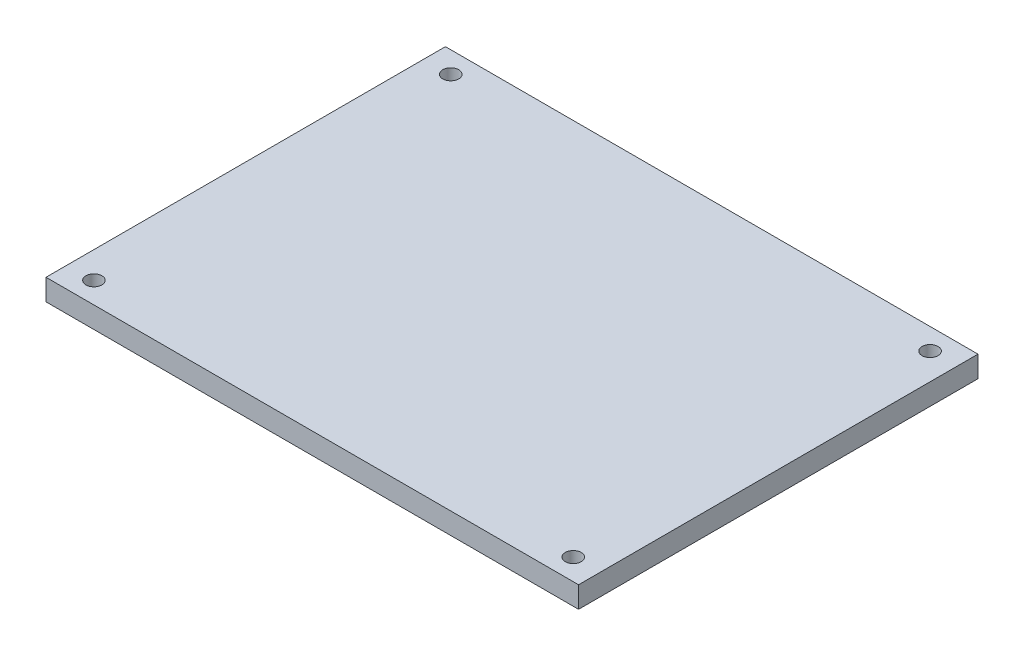
ISO-10303-21;
HEADER;
FILE_DESCRIPTION(('STEP AP214'),'2;1');
FILE_NAME('part.step','',(''),(''),'','','');
FILE_SCHEMA(('AUTOMOTIVE_DESIGN { 1 0 10303 214 1 1 1 1 }'));
ENDSEC;
DATA;
#1=APPLICATION_CONTEXT('core data for automotive mechanical design processes');
#2=APPLICATION_PROTOCOL_DEFINITION('international standard','automotive_design',2000,#1);
#3=PRODUCT_CONTEXT('',#1,'mechanical');
#4=PRODUCT('Part','Part','',(#3));
#5=PRODUCT_RELATED_PRODUCT_CATEGORY('part','',(#4));
#6=PRODUCT_DEFINITION_FORMATION('','',#4);
#7=PRODUCT_DEFINITION_CONTEXT('part definition',#1,'design');
#8=PRODUCT_DEFINITION('design','',#6,#7);
#9=PRODUCT_DEFINITION_SHAPE('','',#8);
#10=(LENGTH_UNIT() NAMED_UNIT(*) SI_UNIT(.MILLI.,.METRE.));
#11=(NAMED_UNIT(*) PLANE_ANGLE_UNIT() SI_UNIT($,.RADIAN.));
#12=(NAMED_UNIT(*) SI_UNIT($,.STERADIAN.) SOLID_ANGLE_UNIT());
#13=UNCERTAINTY_MEASURE_WITH_UNIT(LENGTH_MEASURE(1.E-05),#10,'distance_accuracy_value','');
#14=(GEOMETRIC_REPRESENTATION_CONTEXT(3) GLOBAL_UNCERTAINTY_ASSIGNED_CONTEXT((#13)) GLOBAL_UNIT_ASSIGNED_CONTEXT((#10,
#11,#12)) REPRESENTATION_CONTEXT('',''));
#15=CARTESIAN_POINT('',(0.,0.,0.));
#16=DIRECTION('',(0.,0.,1.));
#17=DIRECTION('',(1.,0.,0.));
#18=AXIS2_PLACEMENT_3D('',#15,#16,#17);
#19=CARTESIAN_POINT('',(0.,4.,0.));
#20=DIRECTION('',(0.,1.,0.));
#21=DIRECTION('',(0.,0.,1.));
#22=AXIS2_PLACEMENT_3D('',#19,#20,#21);
#23=PLANE('',#22);
#24=CARTESIAN_POINT('',(45.,4.,-33.5));
#25=DIRECTION('',(0.,1.,0.));
#26=DIRECTION('',(0.,0.,1.));
#27=AXIS2_PLACEMENT_3D('',#24,#25,#26);
#28=CIRCLE('',#27,1.50000000000002);
#29=CARTESIAN_POINT('',(45.,4.,-32.));
#30=VERTEX_POINT('',#29);
#31=EDGE_CURVE('E146',#30,#30,#28,.T.);
#32=ORIENTED_EDGE('',*,*,#31,.F.);
#33=EDGE_LOOP('',(#32));
#34=FACE_BOUND('',#33,.T.);
#35=CARTESIAN_POINT('',(-45.,4.,-33.5));
#36=DIRECTION('',(0.,1.,0.));
#37=DIRECTION('',(0.,0.,1.));
#38=AXIS2_PLACEMENT_3D('',#35,#36,#37);
#39=CIRCLE('',#38,1.5);
#40=CARTESIAN_POINT('',(-45.,4.,-32.));
#41=VERTEX_POINT('',#40);
#42=EDGE_CURVE('E116',#41,#41,#39,.T.);
#43=ORIENTED_EDGE('',*,*,#42,.F.);
#44=EDGE_LOOP('',(#43));
#45=FACE_BOUND('',#44,.T.);
#46=DIRECTION('',(0.,0.,1.));
#47=VECTOR('',#46,1.);
#48=CARTESIAN_POINT('',(-50.,4.,-37.5));
#49=LINE('',#48,#47);
#50=CARTESIAN_POINT('',(-50.,4.,-37.5));
#51=VERTEX_POINT('',#50);
#52=CARTESIAN_POINT('',(-50.,4.,37.5));
#53=VERTEX_POINT('',#52);
#54=EDGE_CURVE('E96',#51,#53,#49,.T.);
#55=ORIENTED_EDGE('',*,*,#54,.T.);
#56=DIRECTION('',(1.,0.,0.));
#57=VECTOR('',#56,1.);
#58=CARTESIAN_POINT('',(-50.,4.,37.5));
#59=LINE('',#58,#57);
#60=CARTESIAN_POINT('',(50.,4.,37.5));
#61=VERTEX_POINT('',#60);
#62=EDGE_CURVE('E91',#53,#61,#59,.T.);
#63=ORIENTED_EDGE('',*,*,#62,.T.);
#64=DIRECTION('',(0.,0.,-1.));
#65=VECTOR('',#64,1.);
#66=CARTESIAN_POINT('',(50.,4.,-37.5));
#67=LINE('',#66,#65);
#68=CARTESIAN_POINT('',(50.,4.,-37.5));
#69=VERTEX_POINT('',#68);
#70=EDGE_CURVE('E94',#61,#69,#67,.T.);
#71=ORIENTED_EDGE('',*,*,#70,.T.);
#72=DIRECTION('',(-1.,0.,0.));
#73=VECTOR('',#72,1.);
#74=CARTESIAN_POINT('',(-50.,4.,-37.5));
#75=LINE('',#74,#73);
#76=EDGE_CURVE('E61',#69,#51,#75,.T.);
#77=ORIENTED_EDGE('',*,*,#76,.T.);
#78=EDGE_LOOP('',(#55,#63,#71,#77));
#79=FACE_BOUND('',#78,.T.);
#80=CARTESIAN_POINT('',(-45.,4.,33.5));
#81=DIRECTION('',(0.,1.,0.));
#82=DIRECTION('',(0.,0.,1.));
#83=AXIS2_PLACEMENT_3D('',#80,#81,#82);
#84=CIRCLE('',#83,1.5);
#85=CARTESIAN_POINT('',(-45.,4.,35.));
#86=VERTEX_POINT('',#85);
#87=EDGE_CURVE('E138',#86,#86,#84,.T.);
#88=ORIENTED_EDGE('',*,*,#87,.F.);
#89=EDGE_LOOP('',(#88));
#90=FACE_BOUND('',#89,.T.);
#91=CARTESIAN_POINT('',(45.,4.,33.5));
#92=DIRECTION('',(0.,1.,0.));
#93=DIRECTION('',(0.,0.,1.));
#94=AXIS2_PLACEMENT_3D('',#91,#92,#93);
#95=CIRCLE('',#94,1.50000000000002);
#96=CARTESIAN_POINT('',(45.,4.,35.));
#97=VERTEX_POINT('',#96);
#98=EDGE_CURVE('E154',#97,#97,#95,.T.);
#99=ORIENTED_EDGE('',*,*,#98,.F.);
#100=EDGE_LOOP('',(#99));
#101=FACE_BOUND('',#100,.T.);
#102=ADVANCED_FACE('F43',(#34,#45,#79,#90,#101),#23,.T.);
#103=CARTESIAN_POINT('',(0.,0.,0.));
#104=DIRECTION('',(0.,1.,0.));
#105=DIRECTION('',(0.,0.,1.));
#106=AXIS2_PLACEMENT_3D('',#103,#104,#105);
#107=PLANE('',#106);
#108=DIRECTION('',(0.,0.,1.));
#109=VECTOR('',#108,1.);
#110=CARTESIAN_POINT('',(-50.,0.,-37.5));
#111=LINE('',#110,#109);
#112=CARTESIAN_POINT('',(-50.,0.,-37.5));
#113=VERTEX_POINT('',#112);
#114=CARTESIAN_POINT('',(-50.,0.,37.5));
#115=VERTEX_POINT('',#114);
#116=EDGE_CURVE('E112',#113,#115,#111,.T.);
#117=ORIENTED_EDGE('',*,*,#116,.F.);
#118=DIRECTION('',(-1.,0.,0.));
#119=VECTOR('',#118,1.);
#120=CARTESIAN_POINT('',(-50.,0.,-37.5));
#121=LINE('',#120,#119);
#122=CARTESIAN_POINT('',(50.,0.,-37.5));
#123=VERTEX_POINT('',#122);
#124=EDGE_CURVE('E84',#123,#113,#121,.T.);
#125=ORIENTED_EDGE('',*,*,#124,.F.);
#126=DIRECTION('',(0.,0.,-1.));
#127=VECTOR('',#126,1.);
#128=CARTESIAN_POINT('',(50.,0.,-37.5));
#129=LINE('',#128,#127);
#130=CARTESIAN_POINT('',(50.,0.,37.5));
#131=VERTEX_POINT('',#130);
#132=EDGE_CURVE('E78',#131,#123,#129,.T.);
#133=ORIENTED_EDGE('',*,*,#132,.F.);
#134=DIRECTION('',(1.,0.,0.));
#135=VECTOR('',#134,1.);
#136=CARTESIAN_POINT('',(-50.,0.,37.5));
#137=LINE('',#136,#135);
#138=EDGE_CURVE('E101',#115,#131,#137,.T.);
#139=ORIENTED_EDGE('',*,*,#138,.F.);
#140=EDGE_LOOP('',(#117,#125,#133,#139));
#141=FACE_BOUND('',#140,.T.);
#142=CARTESIAN_POINT('',(-45.,0.,-33.5));
#143=DIRECTION('',(0.,1.,0.));
#144=DIRECTION('',(0.,0.,1.));
#145=AXIS2_PLACEMENT_3D('',#142,#143,#144);
#146=CIRCLE('',#145,1.5);
#147=CARTESIAN_POINT('',(-45.,0.,-32.));
#148=VERTEX_POINT('',#147);
#149=EDGE_CURVE('E134',#148,#148,#146,.T.);
#150=ORIENTED_EDGE('',*,*,#149,.T.);
#151=EDGE_LOOP('',(#150));
#152=FACE_BOUND('',#151,.T.);
#153=CARTESIAN_POINT('',(-45.,0.,33.5));
#154=DIRECTION('',(0.,1.,0.));
#155=DIRECTION('',(0.,0.,1.));
#156=AXIS2_PLACEMENT_3D('',#153,#154,#155);
#157=CIRCLE('',#156,1.5);
#158=CARTESIAN_POINT('',(-45.,0.,35.));
#159=VERTEX_POINT('',#158);
#160=EDGE_CURVE('E142',#159,#159,#157,.T.);
#161=ORIENTED_EDGE('',*,*,#160,.T.);
#162=EDGE_LOOP('',(#161));
#163=FACE_BOUND('',#162,.T.);
#164=CARTESIAN_POINT('',(45.,0.,-33.5));
#165=DIRECTION('',(0.,1.,0.));
#166=DIRECTION('',(0.,0.,1.));
#167=AXIS2_PLACEMENT_3D('',#164,#165,#166);
#168=CIRCLE('',#167,1.50000000000002);
#169=CARTESIAN_POINT('',(45.,0.,-32.));
#170=VERTEX_POINT('',#169);
#171=EDGE_CURVE('E150',#170,#170,#168,.T.);
#172=ORIENTED_EDGE('',*,*,#171,.T.);
#173=EDGE_LOOP('',(#172));
#174=FACE_BOUND('',#173,.T.);
#175=CARTESIAN_POINT('',(45.,0.,33.5));
#176=DIRECTION('',(0.,1.,0.));
#177=DIRECTION('',(0.,0.,1.));
#178=AXIS2_PLACEMENT_3D('',#175,#176,#177);
#179=CIRCLE('',#178,1.50000000000002);
#180=CARTESIAN_POINT('',(45.,0.,35.));
#181=VERTEX_POINT('',#180);
#182=EDGE_CURVE('E158',#181,#181,#179,.T.);
#183=ORIENTED_EDGE('',*,*,#182,.T.);
#184=EDGE_LOOP('',(#183));
#185=FACE_BOUND('',#184,.T.);
#186=ADVANCED_FACE('F129',(#141,#152,#163,#174,#185),#107,.F.);
#187=CARTESIAN_POINT('',(-50.,4.,-37.5));
#188=DIRECTION('',(1.,0.,0.));
#189=DIRECTION('',(0.,0.,-1.));
#190=AXIS2_PLACEMENT_3D('',#187,#188,#189);
#191=PLANE('',#190);
#192=ORIENTED_EDGE('',*,*,#116,.T.);
#193=DIRECTION('',(0.,-1.,0.));
#194=VECTOR('',#193,1.);
#195=CARTESIAN_POINT('',(-50.,4.,37.5));
#196=LINE('',#195,#194);
#197=EDGE_CURVE('E11',#53,#115,#196,.T.);
#198=ORIENTED_EDGE('',*,*,#197,.F.);
#199=ORIENTED_EDGE('',*,*,#54,.F.);
#200=DIRECTION('',(0.,-1.,0.));
#201=VECTOR('',#200,1.);
#202=CARTESIAN_POINT('',(-50.,4.,-37.5));
#203=LINE('',#202,#201);
#204=EDGE_CURVE('E108',#51,#113,#203,.T.);
#205=ORIENTED_EDGE('',*,*,#204,.T.);
#206=EDGE_LOOP('',(#192,#198,#199,#205));
#207=FACE_BOUND('',#206,.T.);
#208=ADVANCED_FACE('F45',(#207),#191,.F.);
#209=CARTESIAN_POINT('',(-50.,4.,37.5));
#210=DIRECTION('',(0.,0.,-1.));
#211=DIRECTION('',(-1.,0.,0.));
#212=AXIS2_PLACEMENT_3D('',#209,#210,#211);
#213=PLANE('',#212);
#214=ORIENTED_EDGE('',*,*,#138,.T.);
#215=DIRECTION('',(0.,-1.,0.));
#216=VECTOR('',#215,1.);
#217=CARTESIAN_POINT('',(50.,4.,37.5));
#218=LINE('',#217,#216);
#219=EDGE_CURVE('E53',#61,#131,#218,.T.);
#220=ORIENTED_EDGE('',*,*,#219,.F.);
#221=ORIENTED_EDGE('',*,*,#62,.F.);
#222=ORIENTED_EDGE('',*,*,#197,.T.);
#223=EDGE_LOOP('',(#214,#220,#221,#222));
#224=FACE_BOUND('',#223,.T.);
#225=ADVANCED_FACE('F100',(#224),#213,.F.);
#226=CARTESIAN_POINT('',(50.,4.,-37.5));
#227=DIRECTION('',(-1.,0.,0.));
#228=DIRECTION('',(0.,0.,1.));
#229=AXIS2_PLACEMENT_3D('',#226,#227,#228);
#230=PLANE('',#229);
#231=ORIENTED_EDGE('',*,*,#132,.T.);
#232=DIRECTION('',(0.,-1.,0.));
#233=VECTOR('',#232,1.);
#234=CARTESIAN_POINT('',(50.,4.,-37.5));
#235=LINE('',#234,#233);
#236=EDGE_CURVE('E103',#69,#123,#235,.T.);
#237=ORIENTED_EDGE('',*,*,#236,.F.);
#238=ORIENTED_EDGE('',*,*,#70,.F.);
#239=ORIENTED_EDGE('',*,*,#219,.T.);
#240=EDGE_LOOP('',(#231,#237,#238,#239));
#241=FACE_BOUND('',#240,.T.);
#242=ADVANCED_FACE('F104',(#241),#230,.F.);
#243=CARTESIAN_POINT('',(-50.,4.,-37.5));
#244=DIRECTION('',(0.,0.,1.));
#245=DIRECTION('',(1.,0.,0.));
#246=AXIS2_PLACEMENT_3D('',#243,#244,#245);
#247=PLANE('',#246);
#248=ORIENTED_EDGE('',*,*,#124,.T.);
#249=ORIENTED_EDGE('',*,*,#204,.F.);
#250=ORIENTED_EDGE('',*,*,#76,.F.);
#251=ORIENTED_EDGE('',*,*,#236,.T.);
#252=EDGE_LOOP('',(#248,#249,#250,#251));
#253=FACE_BOUND('',#252,.T.);
#254=ADVANCED_FACE('F126',(#253),#247,.F.);
#255=CARTESIAN_POINT('',(-45.,4.,-33.5));
#256=DIRECTION('',(0.,-1.,0.));
#257=DIRECTION('',(0.,0.,-1.));
#258=AXIS2_PLACEMENT_3D('',#255,#256,#257);
#259=CYLINDRICAL_SURFACE('',#258,1.5);
#260=ORIENTED_EDGE('',*,*,#42,.T.);
#261=EDGE_LOOP('',(#260));
#262=FACE_BOUND('',#261,.T.);
#263=ORIENTED_EDGE('',*,*,#149,.F.);
#264=EDGE_LOOP('',(#263));
#265=FACE_BOUND('',#264,.T.);
#266=ADVANCED_FACE('F179',(#262,#265),#259,.F.);
#267=CARTESIAN_POINT('',(-45.,4.,33.5));
#268=DIRECTION('',(0.,-1.,0.));
#269=DIRECTION('',(0.,0.,-1.));
#270=AXIS2_PLACEMENT_3D('',#267,#268,#269);
#271=CYLINDRICAL_SURFACE('',#270,1.5);
#272=ORIENTED_EDGE('',*,*,#87,.T.);
#273=EDGE_LOOP('',(#272));
#274=FACE_BOUND('',#273,.T.);
#275=ORIENTED_EDGE('',*,*,#160,.F.);
#276=EDGE_LOOP('',(#275));
#277=FACE_BOUND('',#276,.T.);
#278=ADVANCED_FACE('F233',(#274,#277),#271,.F.);
#279=CARTESIAN_POINT('',(45.,4.,-33.5));
#280=DIRECTION('',(0.,-1.,0.));
#281=DIRECTION('',(0.,0.,-1.));
#282=AXIS2_PLACEMENT_3D('',#279,#280,#281);
#283=CYLINDRICAL_SURFACE('',#282,1.50000000000002);
#284=ORIENTED_EDGE('',*,*,#31,.T.);
#285=EDGE_LOOP('',(#284));
#286=FACE_BOUND('',#285,.T.);
#287=ORIENTED_EDGE('',*,*,#171,.F.);
#288=EDGE_LOOP('',(#287));
#289=FACE_BOUND('',#288,.T.);
#290=ADVANCED_FACE('F242',(#286,#289),#283,.F.);
#291=CARTESIAN_POINT('',(45.,4.,33.5));
#292=DIRECTION('',(0.,-1.,0.));
#293=DIRECTION('',(0.,0.,-1.));
#294=AXIS2_PLACEMENT_3D('',#291,#292,#293);
#295=CYLINDRICAL_SURFACE('',#294,1.50000000000002);
#296=ORIENTED_EDGE('',*,*,#98,.T.);
#297=EDGE_LOOP('',(#296));
#298=FACE_BOUND('',#297,.T.);
#299=ORIENTED_EDGE('',*,*,#182,.F.);
#300=EDGE_LOOP('',(#299));
#301=FACE_BOUND('',#300,.T.);
#302=ADVANCED_FACE('F166',(#298,#301),#295,.F.);
#303=CLOSED_SHELL('',(#102,#186,#208,#225,#242,#254,#266,#278,#290,#302));
#304=MANIFOLD_SOLID_BREP('B2',#303);
#305=ADVANCED_BREP_SHAPE_REPRESENTATION('',(#18,#304),#14);
#306=SHAPE_DEFINITION_REPRESENTATION(#9,#305);
ENDSEC;
END-ISO-10303-21;
